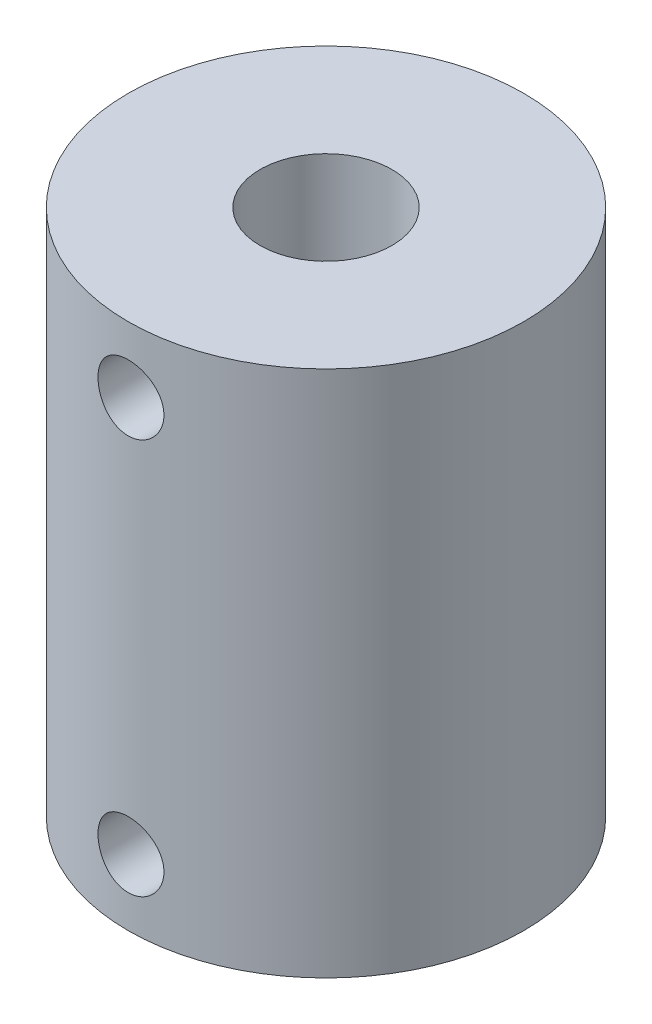
ISO-10303-21;
HEADER;
FILE_DESCRIPTION(('STEP AP214'),'2;1');
FILE_NAME('part.step','',(''),(''),'','','');
FILE_SCHEMA(('AUTOMOTIVE_DESIGN { 1 0 10303 214 1 1 1 1 }'));
ENDSEC;
DATA;
#1=APPLICATION_CONTEXT('core data for automotive mechanical design processes');
#2=APPLICATION_PROTOCOL_DEFINITION('international standard','automotive_design',2000,#1);
#3=PRODUCT_CONTEXT('',#1,'mechanical');
#4=PRODUCT('Part','Part','',(#3));
#5=PRODUCT_RELATED_PRODUCT_CATEGORY('part','',(#4));
#6=PRODUCT_DEFINITION_FORMATION('','',#4);
#7=PRODUCT_DEFINITION_CONTEXT('part definition',#1,'design');
#8=PRODUCT_DEFINITION('design','',#6,#7);
#9=PRODUCT_DEFINITION_SHAPE('','',#8);
#10=(LENGTH_UNIT() NAMED_UNIT(*) SI_UNIT(.MILLI.,.METRE.));
#11=(NAMED_UNIT(*) PLANE_ANGLE_UNIT() SI_UNIT($,.RADIAN.));
#12=(NAMED_UNIT(*) SI_UNIT($,.STERADIAN.) SOLID_ANGLE_UNIT());
#13=UNCERTAINTY_MEASURE_WITH_UNIT(LENGTH_MEASURE(1.E-05),#10,'distance_accuracy_value','');
#14=(GEOMETRIC_REPRESENTATION_CONTEXT(3) GLOBAL_UNCERTAINTY_ASSIGNED_CONTEXT((#13)) GLOBAL_UNIT_ASSIGNED_CONTEXT((#10,
#11,#12)) REPRESENTATION_CONTEXT('',''));
#15=CARTESIAN_POINT('',(0.,0.,0.));
#16=DIRECTION('',(0.,0.,1.));
#17=DIRECTION('',(1.,0.,0.));
#18=AXIS2_PLACEMENT_3D('',#15,#16,#17);
#19=CARTESIAN_POINT('',(0.,25.4,0.));
#20=DIRECTION('',(0.,-1.,0.));
#21=DIRECTION('',(0.,0.,-1.));
#22=AXIS2_PLACEMENT_3D('',#19,#20,#21);
#23=CYLINDRICAL_SURFACE('',#22,9.525);
#24=CARTESIAN_POINT('',(0.,25.4,0.));
#25=DIRECTION('',(0.,1.,0.));
#26=DIRECTION('',(0.,0.,1.));
#27=AXIS2_PLACEMENT_3D('',#24,#25,#26);
#28=CIRCLE('',#27,9.525);
#29=CARTESIAN_POINT('',(0.,25.4,9.525));
#30=VERTEX_POINT('',#29);
#31=EDGE_CURVE('E55',#30,#30,#28,.T.);
#32=ORIENTED_EDGE('',*,*,#31,.F.);
#33=EDGE_LOOP('',(#32));
#34=FACE_BOUND('',#33,.T.);
#35=CARTESIAN_POINT('',(0.,0.,0.));
#36=DIRECTION('',(0.,1.,0.));
#37=DIRECTION('',(0.,0.,1.));
#38=AXIS2_PLACEMENT_3D('',#35,#36,#37);
#39=CIRCLE('',#38,9.525);
#40=CARTESIAN_POINT('',(0.,0.,9.525));
#41=VERTEX_POINT('',#40);
#42=EDGE_CURVE('E59',#41,#41,#39,.T.);
#43=ORIENTED_EDGE('',*,*,#42,.T.);
#44=EDGE_LOOP('',(#43));
#45=FACE_BOUND('',#44,.T.);
#46=CARTESIAN_POINT('',(0.,20.6375,9.525));
#47=CARTESIAN_POINT('',(0.0885132246484665,20.6375035489819,9.52499848342203));
#48=CARTESIAN_POINT('',(0.177074754967651,20.6449277696053,9.52375335474776));
#49=CARTESIAN_POINT('',(0.351713940762382,20.674416143316,9.51890619037781));
#50=CARTESIAN_POINT('',(0.437789236154121,20.6964937586389,9.5153019874167));
#51=CARTESIAN_POINT('',(0.604904014480028,20.7546038098564,9.50614093330146));
#52=CARTESIAN_POINT('',(0.685947553954255,20.7906248306818,9.50058567976088));
#53=CARTESIAN_POINT('',(0.840830069655994,20.8755693054533,9.48813334197115));
#54=CARTESIAN_POINT('',(0.914669868572905,20.9244912837017,9.48123641121565));
#55=CARTESIAN_POINT('',(1.05376511007522,21.034346478226,9.46679156586028));
#56=CARTESIAN_POINT('',(1.1189416937447,21.0953788877939,9.45923858602434));
#57=CARTESIAN_POINT('',(1.23817919664905,21.2275089599802,9.44437168066725));
#58=CARTESIAN_POINT('',(1.29223941411327,21.2986072575749,9.43705777026294));
#59=CARTESIAN_POINT('',(1.38802562475926,21.4493925635351,9.42344804257461));
#60=CARTESIAN_POINT('',(1.42967364106673,21.529129748871,9.41715876973189));
#61=CARTESIAN_POINT('',(1.49895456203612,21.6945905733309,9.40638066519618));
#62=CARTESIAN_POINT('',(1.52658841339416,21.7803138076353,9.40189171189085));
#63=CARTESIAN_POINT('',(1.56680812989335,21.9544774745339,9.3952729089515));
#64=CARTESIAN_POINT('',(1.57953013350098,22.0428856426784,9.39312172988419));
#65=CARTESIAN_POINT('',(1.58998712055907,22.220605975821,9.39135751224772));
#66=CARTESIAN_POINT('',(1.58772316464701,22.3099180763962,9.39174429405331));
#67=CARTESIAN_POINT('',(1.56838338748156,22.4859391919099,9.39499282328357));
#68=CARTESIAN_POINT('',(1.55146050000001,22.5726655502512,9.39782901557512));
#69=CARTESIAN_POINT('',(1.50352324415619,22.7420305368215,9.4056167945899));
#70=CARTESIAN_POINT('',(1.47250839249303,22.8246690247442,9.41056845386527));
#71=CARTESIAN_POINT('',(1.39711255126963,22.983970302885,9.42205684377153));
#72=CARTESIAN_POINT('',(1.35266805531362,23.0606024728616,9.42860107613151));
#73=CARTESIAN_POINT('',(1.25171963114897,23.2053792943419,9.44253203193531));
#74=CARTESIAN_POINT('',(1.19521472961547,23.2735232601089,9.44991882335472));
#75=CARTESIAN_POINT('',(1.070916204721,23.4002745644877,9.46481487703664));
#76=CARTESIAN_POINT('',(1.00299136705944,23.4587532592729,9.47232452262099));
#77=CARTESIAN_POINT('',(0.858224883103348,23.5635023792925,9.48653551886919));
#78=CARTESIAN_POINT('',(0.781383179360579,23.6097727258663,9.49323686432489));
#79=CARTESIAN_POINT('',(0.620843256765861,23.6888034142315,9.50508571986999));
#80=CARTESIAN_POINT('',(0.53713934073356,23.7215523912753,9.51023192188729));
#81=CARTESIAN_POINT('',(0.365314449457734,23.7724913266812,9.51838014413039));
#82=CARTESIAN_POINT('',(0.277193844378962,23.7906825029783,9.52138234372551));
#83=CARTESIAN_POINT('',(0.100145787326531,23.8118150626228,9.52488017450106));
#84=CARTESIAN_POINT('',(0.0112399680908924,23.8149330480966,9.52540483163118));
#85=CARTESIAN_POINT('',(-0.165823755785078,23.8063015462881,9.52396796257443));
#86=CARTESIAN_POINT('',(-0.253981689071444,23.7945526310601,9.52200653204815));
#87=CARTESIAN_POINT('',(-0.426501671472194,23.756667720672,9.51583585105758));
#88=CARTESIAN_POINT('',(-0.510883451424715,23.7306191576723,9.51164026548832));
#89=CARTESIAN_POINT('',(-0.67408227188638,23.6649675809433,9.50146984929153));
#90=CARTESIAN_POINT('',(-0.752898999602671,23.6253638060516,9.49549491875133));
#91=CARTESIAN_POINT('',(-0.903497487812788,23.5333215358175,9.48235667852029));
#92=CARTESIAN_POINT('',(-0.975210934345088,23.4807727258338,9.47518333488259));
#93=CARTESIAN_POINT('',(-1.10886467679421,23.3644838047305,9.46047426793857));
#94=CARTESIAN_POINT('',(-1.17080426220733,23.3007428807193,9.45293851833932));
#95=CARTESIAN_POINT('',(-1.28380666508283,23.1630870569746,9.43826011274762));
#96=CARTESIAN_POINT('',(-1.33475016330721,23.0890736048983,9.43112233747062));
#97=CARTESIAN_POINT('',(-1.42348096703731,22.933435864597,9.41813921408956));
#98=CARTESIAN_POINT('',(-1.46126868957884,22.8518118177305,9.41229382501923));
#99=CARTESIAN_POINT('',(-1.52243684048545,22.6836035196643,9.40259393098042));
#100=CARTESIAN_POINT('',(-1.54587665966794,22.5970413596556,9.39873122987526));
#101=CARTESIAN_POINT('',(-1.57787051314921,22.4211387179442,9.39341350190391));
#102=CARTESIAN_POINT('',(-1.58642584158582,22.3317984784701,9.39195826572028));
#103=CARTESIAN_POINT('',(-1.58837176994007,22.1540672196139,9.39162925508347));
#104=CARTESIAN_POINT('',(-1.58195018643949,22.0656782596047,9.39272350881088));
#105=CARTESIAN_POINT('',(-1.5545306977376,21.8912571774878,9.39730011223118));
#106=CARTESIAN_POINT('',(-1.53353283978142,21.8052250477419,9.40078245418371));
#107=CARTESIAN_POINT('',(-1.47762880089276,21.6380323923192,9.40973071238892));
#108=CARTESIAN_POINT('',(-1.44273879003128,21.5568663286144,9.4151943218449));
#109=CARTESIAN_POINT('',(-1.3600601474866,21.4015093500613,9.42749174265602));
#110=CARTESIAN_POINT('',(-1.31227087605534,21.3273187814137,9.43432562196633));
#111=CARTESIAN_POINT('',(-1.20447999157632,21.1870699047266,9.4486949331897));
#112=CARTESIAN_POINT('',(-1.14434020788197,21.1211185293953,9.45623772690952));
#113=CARTESIAN_POINT('',(-1.01384673492645,21.0001792311584,9.47111626449134));
#114=CARTESIAN_POINT('',(-0.943490691699524,20.9451938419148,9.47845196016857));
#115=CARTESIAN_POINT('',(-0.793984422721577,20.847400349693,9.4921484632281));
#116=CARTESIAN_POINT('',(-0.714776820083338,20.8046789650363,9.49850218820721));
#117=CARTESIAN_POINT('',(-0.550235799055653,20.7332138772727,9.50944991427127));
#118=CARTESIAN_POINT('',(-0.464908579217056,20.7044562535144,9.51404566692701));
#119=CARTESIAN_POINT('',(-0.31604160187883,20.6679766509296,9.51995677178927));
#120=CARTESIAN_POINT('',(-0.253402357239514,20.6565662117939,9.52183787318583));
#121=CARTESIAN_POINT('',(-0.127183712053079,20.6413266764686,9.52436002151187));
#122=CARTESIAN_POINT('',(-0.0636043277113938,20.6374974497528,9.52500108979108));
#123=CARTESIAN_POINT('',(0.,20.6375,9.525));
#124=B_SPLINE_CURVE_WITH_KNOTS('',3,(#46,#47,#48,#49,#50,#51,#52,#53,#54,#55,#56,#57,#58,#59,
#60,#61,#62,#63,#64,#65,#66,#67,#68,#69,#70,#71,#72,#73,#74,#75,#76,#77,#78,#79,#80,#81,#82,#83,
#84,#85,#86,#87,#88,#89,#90,#91,#92,#93,#94,#95,#96,#97,#98,#99,#100,#101,#102,#103,#104,#105,
#106,#107,#108,#109,#110,#111,#112,#113,#114,#115,#116,#117,#118,#119,#120,#121,#122,#123),
.UNSPECIFIED.,.T.,.F.,(4,2,2,2,2,2,2,2,2,2,2,2,2,2,2,2,2,2,2,2,2,2,2,2,2,2,2,2,2,2,2,2,2,2,2,2,
2,2,4),(0.,0.265307181435954,0.530858441516591,0.796192760561045,1.06149674204849,
1.32907081824581,1.59666178107859,1.86590000723138,2.13512004316375,2.40186258960674,
2.66858625743763,2.93256031317859,3.19654342291117,3.46179493461674,3.72706786132164,
3.99562808893692,4.26419004688763,4.53297727461598,4.80174201270929,5.06735006017037,
5.33294788777771,5.59693957449074,5.86094608749552,6.1272853427316,6.3936439503947,
6.66276176974838,6.93187105733724,7.19985874187025,7.46782312494502,7.73244522546914,
7.99706646829464,8.26138059573651,8.52570783443628,8.79317128962803,9.06069647013147,
9.33006917070572,9.59917277602595,9.78982197584151,9.98046789320874),.UNSPECIFIED.);
#125=CARTESIAN_POINT('',(0.,20.6375,9.525));
#126=VERTEX_POINT('',#125);
#127=EDGE_CURVE('E85',#126,#126,#124,.T.);
#128=ORIENTED_EDGE('',*,*,#127,.F.);
#129=EDGE_LOOP('',(#128));
#130=FACE_BOUND('',#129,.T.);
#131=CARTESIAN_POINT('',(0.,1.5875,9.525));
#132=CARTESIAN_POINT('',(0.0885132246484664,1.58750354898186,9.52499848342203));
#133=CARTESIAN_POINT('',(0.177074754967651,1.59492776960526,9.52375335474776));
#134=CARTESIAN_POINT('',(0.351713940762382,1.62441614331598,9.51890619037781));
#135=CARTESIAN_POINT('',(0.437789236154122,1.64649375863887,9.5153019874167));
#136=CARTESIAN_POINT('',(0.604904014480029,1.7046038098564,9.50614093330146));
#137=CARTESIAN_POINT('',(0.685947553954257,1.74062483068176,9.50058567976088));
#138=CARTESIAN_POINT('',(0.840830069655995,1.82556930545327,9.48813334197115));
#139=CARTESIAN_POINT('',(0.914669868572905,1.8744912837017,9.48123641121565));
#140=CARTESIAN_POINT('',(1.05376511007522,1.98434647822599,9.46679156586028));
#141=CARTESIAN_POINT('',(1.1189416937447,2.04537888779394,9.45923858602434));
#142=CARTESIAN_POINT('',(1.23817919664905,2.17750895998023,9.44437168066725));
#143=CARTESIAN_POINT('',(1.29223941411327,2.24860725757495,9.43705777026294));
#144=CARTESIAN_POINT('',(1.38802562475926,2.39939256353513,9.42344804257461));
#145=CARTESIAN_POINT('',(1.42967364106674,2.47912974887102,9.41715876973189));
#146=CARTESIAN_POINT('',(1.49895456203612,2.64459057333089,9.40638066519618));
#147=CARTESIAN_POINT('',(1.52658841339416,2.73031380763529,9.40189171189085));
#148=CARTESIAN_POINT('',(1.56680812989335,2.9044774745339,9.3952729089515));
#149=CARTESIAN_POINT('',(1.57953013350098,2.99288564267838,9.39312172988419));
#150=CARTESIAN_POINT('',(1.58998712055907,3.170605975821,9.39135751224772));
#151=CARTESIAN_POINT('',(1.58772316464701,3.25991807639623,9.39174429405331));
#152=CARTESIAN_POINT('',(1.56838338748156,3.43593919190991,9.39499282328357));
#153=CARTESIAN_POINT('',(1.55146050000001,3.52266555025122,9.39782901557512));
#154=CARTESIAN_POINT('',(1.50352324415619,3.6920305368215,9.4056167945899));
#155=CARTESIAN_POINT('',(1.47250839249304,3.77466902474422,9.41056845386527));
#156=CARTESIAN_POINT('',(1.39711255126963,3.93397030288498,9.42205684377153));
#157=CARTESIAN_POINT('',(1.35266805531362,4.01060247286158,9.42860107613151));
#158=CARTESIAN_POINT('',(1.25171963114897,4.15537929434187,9.44253203193531));
#159=CARTESIAN_POINT('',(1.19521472961547,4.22352326010888,9.44991882335472));
#160=CARTESIAN_POINT('',(1.070916204721,4.35027456448766,9.46481487703664));
#161=CARTESIAN_POINT('',(1.00299136705943,4.40875325927295,9.47232452262099));
#162=CARTESIAN_POINT('',(0.858224883103345,4.51350237929249,9.48653551886919));
#163=CARTESIAN_POINT('',(0.781383179360577,4.55977272586635,9.49323686432489));
#164=CARTESIAN_POINT('',(0.620843256765861,4.63880341423154,9.50508571986999));
#165=CARTESIAN_POINT('',(0.537139340733559,4.67155239127535,9.51023192188729));
#166=CARTESIAN_POINT('',(0.365314449457734,4.72249132668119,9.51838014413039));
#167=CARTESIAN_POINT('',(0.277193844378962,4.74068250297831,9.52138234372551));
#168=CARTESIAN_POINT('',(0.10014578732653,4.76181506262282,9.52488017450106));
#169=CARTESIAN_POINT('',(0.0112399680908913,4.76493304809656,9.52540483163118));
#170=CARTESIAN_POINT('',(-0.165823755785079,4.75630154628814,9.52396796257443));
#171=CARTESIAN_POINT('',(-0.253981689071445,4.74455263106007,9.52200653204815));
#172=CARTESIAN_POINT('',(-0.426501671472195,4.70666772067197,9.51583585105758));
#173=CARTESIAN_POINT('',(-0.510883451424716,4.68061915767227,9.51164026548833));
#174=CARTESIAN_POINT('',(-0.674082271886381,4.61496758094329,9.50146984929153));
#175=CARTESIAN_POINT('',(-0.752898999602672,4.5753638060516,9.49549491875132));
#176=CARTESIAN_POINT('',(-0.903497487812789,4.48332153581754,9.48235667852029));
#177=CARTESIAN_POINT('',(-0.975210934345089,4.43077272583379,9.47518333488259));
#178=CARTESIAN_POINT('',(-1.10886467679421,4.31448380473048,9.46047426793857));
#179=CARTESIAN_POINT('',(-1.17080426220733,4.25074288071931,9.45293851833932));
#180=CARTESIAN_POINT('',(-1.28380666508283,4.11308705697464,9.43826011274762));
#181=CARTESIAN_POINT('',(-1.33475016330721,4.03907360489835,9.43112233747062));
#182=CARTESIAN_POINT('',(-1.42348096703732,3.88343586459702,9.41813921408956));
#183=CARTESIAN_POINT('',(-1.46126868957884,3.80181181773054,9.41229382501923));
#184=CARTESIAN_POINT('',(-1.52243684048545,3.63360351966429,9.40259393098042));
#185=CARTESIAN_POINT('',(-1.54587665966795,3.54704135965564,9.39873122987526));
#186=CARTESIAN_POINT('',(-1.57787051314921,3.37113871794418,9.39341350190391));
#187=CARTESIAN_POINT('',(-1.58642584158582,3.28179847847014,9.39195826572028));
#188=CARTESIAN_POINT('',(-1.58837176994007,3.10406721961387,9.39162925508347));
#189=CARTESIAN_POINT('',(-1.58195018643949,3.01567825960469,9.39272350881088));
#190=CARTESIAN_POINT('',(-1.5545306977376,2.84125717748776,9.39730011223117));
#191=CARTESIAN_POINT('',(-1.53353283978142,2.75522504774191,9.40078245418371));
#192=CARTESIAN_POINT('',(-1.47762880089276,2.58803239231919,9.40973071238892));
#193=CARTESIAN_POINT('',(-1.44273879003128,2.50686632861442,9.4151943218449));
#194=CARTESIAN_POINT('',(-1.3600601474866,2.35150935006127,9.42749174265602));
#195=CARTESIAN_POINT('',(-1.31227087605534,2.27731878141369,9.43432562196633));
#196=CARTESIAN_POINT('',(-1.20447999157632,2.13706990472657,9.4486949331897));
#197=CARTESIAN_POINT('',(-1.14434020788197,2.07111852939532,9.45623772690952));
#198=CARTESIAN_POINT('',(-1.01384673492645,1.95017923115841,9.47111626449134));
#199=CARTESIAN_POINT('',(-0.943490691699524,1.89519384191476,9.47845196016857));
#200=CARTESIAN_POINT('',(-0.793984422721578,1.79740034969303,9.4921484632281));
#201=CARTESIAN_POINT('',(-0.714776820083339,1.75467896503627,9.49850218820721));
#202=CARTESIAN_POINT('',(-0.550235799055653,1.6832138772727,9.50944991427127));
#203=CARTESIAN_POINT('',(-0.464908579217056,1.65445625351439,9.51404566692701));
#204=CARTESIAN_POINT('',(-0.316041601878829,1.61797665092956,9.51995677178927));
#205=CARTESIAN_POINT('',(-0.253402357239514,1.60656621179386,9.52183787318583));
#206=CARTESIAN_POINT('',(-0.127183712053079,1.59132667646858,9.52436002151187));
#207=CARTESIAN_POINT('',(-0.0636043277113937,1.58749744975277,9.52500108979108));
#208=CARTESIAN_POINT('',(0.,1.5875,9.525));
#209=B_SPLINE_CURVE_WITH_KNOTS('',3,(#131,#132,#133,#134,#135,#136,#137,#138,#139,#140,#141,
#142,#143,#144,#145,#146,#147,#148,#149,#150,#151,#152,#153,#154,#155,#156,#157,#158,#159,#160,
#161,#162,#163,#164,#165,#166,#167,#168,#169,#170,#171,#172,#173,#174,#175,#176,#177,#178,#179,
#180,#181,#182,#183,#184,#185,#186,#187,#188,#189,#190,#191,#192,#193,#194,#195,#196,#197,#198,
#199,#200,#201,#202,#203,#204,#205,#206,#207,#208),.UNSPECIFIED.,.T.,.F.,(4,2,2,2,2,2,2,2,2,2,2,
2,2,2,2,2,2,2,2,2,2,2,2,2,2,2,2,2,2,2,2,2,2,2,2,2,2,2,4),(0.,0.265307181435954,
0.530858441516592,0.796192760561047,1.06149674204849,1.32907081824581,1.59666178107859,
1.86590000723138,2.13512004316375,2.40186258960674,2.66858625743763,2.93256031317859,
3.19654342291117,3.46179493461674,3.72706786132164,3.99562808893692,4.26419004688763,
4.53297727461599,4.8017420127093,5.06735006017037,5.33294788777771,5.59693957449074,
5.86094608749552,6.1272853427316,6.3936439503947,6.66276176974838,6.93187105733724,
7.19985874187025,7.46782312494502,7.73244522546915,7.99706646829464,8.26138059573652,
8.52570783443628,8.79317128962804,9.06069647013148,9.33006917070572,9.59917277602596,
9.78982197584151,9.98046789320875),.UNSPECIFIED.);
#210=CARTESIAN_POINT('',(0.,1.5875,9.525));
#211=VERTEX_POINT('',#210);
#212=EDGE_CURVE('E12',#211,#211,#209,.T.);
#213=ORIENTED_EDGE('',*,*,#212,.F.);
#214=EDGE_LOOP('',(#213));
#215=FACE_BOUND('',#214,.T.);
#216=ADVANCED_FACE('F43',(#34,#45,#130,#215),#23,.T.);
#217=CARTESIAN_POINT('',(0.,12.7,0.));
#218=DIRECTION('',(0.,1.,0.));
#219=DIRECTION('',(0.,0.,1.));
#220=AXIS2_PLACEMENT_3D('',#217,#218,#219);
#221=CYLINDRICAL_SURFACE('',#220,3.175);
#222=CARTESIAN_POINT('',(0.,25.4,0.));
#223=DIRECTION('',(0.,1.,0.));
#224=DIRECTION('',(0.,0.,1.));
#225=AXIS2_PLACEMENT_3D('',#222,#223,#224);
#226=CIRCLE('',#225,3.175);
#227=CARTESIAN_POINT('',(0.,25.4,3.175));
#228=VERTEX_POINT('',#227);
#229=EDGE_CURVE('E91',#228,#228,#226,.T.);
#230=ORIENTED_EDGE('',*,*,#229,.T.);
#231=EDGE_LOOP('',(#230));
#232=FACE_BOUND('',#231,.T.);
#233=CARTESIAN_POINT('',(0.,12.7,0.));
#234=DIRECTION('',(0.,1.,0.));
#235=DIRECTION('',(0.,0.,1.));
#236=AXIS2_PLACEMENT_3D('',#233,#234,#235);
#237=CIRCLE('',#236,3.175);
#238=CARTESIAN_POINT('',(0.,12.7,3.175));
#239=VERTEX_POINT('',#238);
#240=EDGE_CURVE('E94',#239,#239,#237,.T.);
#241=ORIENTED_EDGE('',*,*,#240,.F.);
#242=EDGE_LOOP('',(#241));
#243=FACE_BOUND('',#242,.T.);
#244=CARTESIAN_POINT('',(0.,20.6375,3.175));
#245=CARTESIAN_POINT('',(-0.0834579911850833,20.6375052424285,3.17499545030503));
#246=CARTESIAN_POINT('',(-0.167015477019881,20.6441199910797,3.17167404493863));
#247=CARTESIAN_POINT('',(-0.331660873489373,20.6702864475422,3.15871472708987));
#248=CARTESIAN_POINT('',(-0.412743787657887,20.689862723884,3.1490648192841));
#249=CARTESIAN_POINT('',(-0.569807002497712,20.7409951711789,3.12445843552858));
#250=CARTESIAN_POINT('',(-0.645805799665893,20.7725047849936,3.10952259694341));
#251=CARTESIAN_POINT('',(-0.791325279180474,20.8463683614169,3.07571420218771));
#252=CARTESIAN_POINT('',(-0.860846471709217,20.8887214689951,3.05684195643221));
#253=CARTESIAN_POINT('',(-0.99616866069703,20.9859836335579,3.01555559984673));
#254=CARTESIAN_POINT('',(-1.06149014765635,21.0414972857929,2.99299628614965));
#255=CARTESIAN_POINT('',(-1.18233736872633,21.1622028483047,2.94735202766704));
#256=CARTESIAN_POINT('',(-1.23785563818199,21.2274020646888,2.92426669731842));
#257=CARTESIAN_POINT('',(-1.34183755071482,21.3716923173684,2.87812085025789));
#258=CARTESIAN_POINT('',(-1.38942022018822,21.4514685561241,2.85520109315084));
#259=CARTESIAN_POINT('',(-1.47029206018898,21.6191581458781,2.81441491301059));
#260=CARTESIAN_POINT('',(-1.50359144125905,21.7070656293474,2.79654488326096));
#261=CARTESIAN_POINT('',(-1.55278525197438,21.8831558548573,2.76951863922521));
#262=CARTESIAN_POINT('',(-1.5696022981152,21.971007067657,2.75990481139145));
#263=CARTESIAN_POINT('',(-1.58817785187779,22.1487664049749,2.74926250293288));
#264=CARTESIAN_POINT('',(-1.58995124029225,22.238672408633,2.7482255383247));
#265=CARTESIAN_POINT('',(-1.57906606838602,22.4064290636006,2.75448601783382));
#266=CARTESIAN_POINT('',(-1.5681079882647,22.4844356495666,2.76080162313447));
#267=CARTESIAN_POINT('',(-1.53501701037788,22.6373085311297,2.77933513114987));
#268=CARTESIAN_POINT('',(-1.51288055293752,22.7121738181722,2.79155491395445));
#269=CARTESIAN_POINT('',(-1.45765802636278,22.858776247948,2.82078868805226));
#270=CARTESIAN_POINT('',(-1.42432891904664,22.9303999080724,2.83790772054098));
#271=CARTESIAN_POINT('',(-1.34785367917295,23.0673819394866,2.87501654296728));
#272=CARTESIAN_POINT('',(-1.30470313705229,23.1327374777651,2.89500762088552));
#273=CARTESIAN_POINT('',(-1.20342986217405,23.2640524887299,2.93867138171466));
#274=CARTESIAN_POINT('',(-1.14410245266124,23.3290377868021,2.96248947500834));
#275=CARTESIAN_POINT('',(-1.01529448125193,23.4485424770131,3.00906851989396));
#276=CARTESIAN_POINT('',(-0.94580909481168,23.5030568673538,3.03182896234596));
#277=CARTESIAN_POINT('',(-0.794569953008061,23.6024509868847,3.07501904811705));
#278=CARTESIAN_POINT('',(-0.712396326664063,23.6467657500076,3.09529137357186));
#279=CARTESIAN_POINT('',(-0.540490117088466,23.7205790336058,3.12988136279972));
#280=CARTESIAN_POINT('',(-0.450763602321126,23.7500893187116,3.14420375322891));
#281=CARTESIAN_POINT('',(-0.274266805511365,23.7910297034002,3.16427379814529));
#282=CARTESIAN_POINT('',(-0.187867179745468,23.803754836748,3.1706333955333));
#283=CARTESIAN_POINT('',(-0.0139376149195961,23.814825260676,3.17615908866327));
#284=CARTESIAN_POINT('',(0.0735917690434798,23.8131773634527,3.17532859220093));
#285=CARTESIAN_POINT('',(0.240082343027754,23.7962968821352,3.16692267702328));
#286=CARTESIAN_POINT('',(0.319181810279263,23.7821271042911,3.15987502529967));
#287=CARTESIAN_POINT('',(0.473720941529331,23.7422720608665,3.14042696962309));
#288=CARTESIAN_POINT('',(0.5491602010346,23.7165855257551,3.12802597555879));
#289=CARTESIAN_POINT('',(0.696735665913696,23.6537524345376,3.09854999119071));
#290=CARTESIAN_POINT('',(0.768715755246711,23.6162992079404,3.08135149809289));
#291=CARTESIAN_POINT('',(0.905607411697592,23.5313417871611,3.043935592289));
#292=CARTESIAN_POINT('',(0.970515949770338,23.4838333113298,3.02371689462515));
#293=CARTESIAN_POINT('',(1.09818120674663,23.3747303247875,2.97986801371214));
#294=CARTESIAN_POINT('',(1.1601006735377,23.3122106963433,2.95609779689055));
#295=CARTESIAN_POINT('',(1.27294690977618,23.1776188223466,2.90929046679002));
#296=CARTESIAN_POINT('',(1.3238660748176,23.1055400238289,2.88625386997575));
#297=CARTESIAN_POINT('',(1.41558631423544,22.9494656990004,2.84243767627802));
#298=CARTESIAN_POINT('',(1.45577797458289,22.865062115075,2.82182140722634));
#299=CARTESIAN_POINT('',(1.52095648617134,22.6893277677247,2.78723839766939));
#300=CARTESIAN_POINT('',(1.54596292893889,22.5980061017338,2.77326309427028));
#301=CARTESIAN_POINT('',(1.57775542885366,22.4204050211705,2.75528882878461));
#302=CARTESIAN_POINT('',(1.58606013179365,22.3344831226716,2.75046096250791));
#303=CARTESIAN_POINT('',(1.58859403257222,22.1623777808763,2.74900000493545));
#304=CARTESIAN_POINT('',(1.5828293315144,22.0761944671286,2.75236336156894));
#305=CARTESIAN_POINT('',(1.55880772437938,21.9146699413157,2.76602606006084));
#306=CARTESIAN_POINT('',(1.54179319901956,21.8390780036452,2.7756341249122));
#307=CARTESIAN_POINT('',(1.49729088118125,21.6919046104138,2.79988988197899));
#308=CARTESIAN_POINT('',(1.46979971971638,21.6203244534289,2.81453919516849));
#309=CARTESIAN_POINT('',(1.40305749566465,21.4778830490589,2.848427919537));
#310=CARTESIAN_POINT('',(1.36314043128242,21.4073932058464,2.86790959303524));
#311=CARTESIAN_POINT('',(1.27341466747436,21.2736516738123,2.90886088970341));
#312=CARTESIAN_POINT('',(1.22360082184598,21.2104037777977,2.93033154400532));
#313=CARTESIAN_POINT('',(1.10839778107493,21.084949603012,2.97596438013471));
#314=CARTESIAN_POINT('',(1.04185152150815,21.0238036750189,3.00013660999272));
#315=CARTESIAN_POINT('',(0.898770754895199,20.9133075137965,3.0460593171264));
#316=CARTESIAN_POINT('',(0.822230898247,20.8639636385915,3.06780848569085));
#317=CARTESIAN_POINT('',(0.660291409892925,20.7784122741946,3.10670590186878));
#318=CARTESIAN_POINT('',(0.574832962245558,20.7423001313371,3.12382053184118));
#319=CARTESIAN_POINT('',(0.398053085556711,20.6854295336851,3.15120879312142));
#320=CARTESIAN_POINT('',(0.306749131847695,20.6646274431959,3.1615018583887));
#321=CARTESIAN_POINT('',(0.178755590054295,20.6471878599014,3.17016545787646));
#322=CARTESIAN_POINT('',(0.143131983613483,20.6435600576247,3.17197367477648));
#323=CARTESIAN_POINT('',(0.0716783742405821,20.6387149684964,3.17439193950695));
#324=CARTESIAN_POINT('',(0.0358483656390223,20.6374977481785,3.17500195426617));
#325=CARTESIAN_POINT('',(0.,20.6375,3.175));
#326=B_SPLINE_CURVE_WITH_KNOTS('',3,(#244,#245,#246,#247,#248,#249,#250,#251,#252,#253,#254,
#255,#256,#257,#258,#259,#260,#261,#262,#263,#264,#265,#266,#267,#268,#269,#270,#271,#272,#273,
#274,#275,#276,#277,#278,#279,#280,#281,#282,#283,#284,#285,#286,#287,#288,#289,#290,#291,#292,
#293,#294,#295,#296,#297,#298,#299,#300,#301,#302,#303,#304,#305,#306,#307,#308,#309,#310,#311,
#312,#313,#314,#315,#316,#317,#318,#319,#320,#321,#322,#323,#324,#325),.UNSPECIFIED.,.T.,.F.,(4,
2,2,2,2,2,2,2,2,2,2,2,2,2,2,2,2,2,2,2,2,2,2,2,2,2,2,2,2,2,2,2,2,2,2,2,2,2,2,2,4),(0.,
0.250228508654714,0.50093268766335,0.750668671844021,1.00038496992324,1.26520854196496,
1.53023290227578,1.8158099070882,2.10118242288521,2.36947094272614,2.63749404759819,
2.87346568449796,3.10951251232014,3.35105756267473,3.59271127500602,3.86500594367531,
4.13743036175414,4.42250547765424,4.70735369348243,4.96860973623261,5.22974196161968,
5.47063464078468,5.71155388089103,5.95936158944288,6.20727503062988,6.47953381898014,
6.75198021926997,7.03762057931739,7.32289162713402,7.58077775661086,7.83855207535176,
8.07176964270058,8.30506226951507,8.55402875138705,8.80312503315513,9.08248822877009,
9.36200158617727,9.64349121690848,9.92417542436074,10.0316550721259,10.1391376863632),.UNSPECIFIED.);
#327=CARTESIAN_POINT('',(0.,20.6375,3.175));
#328=VERTEX_POINT('',#327);
#329=EDGE_CURVE('E64',#328,#328,#326,.T.);
#330=ORIENTED_EDGE('',*,*,#329,.F.);
#331=EDGE_LOOP('',(#330));
#332=FACE_BOUND('',#331,.T.);
#333=ADVANCED_FACE('F112',(#232,#243,#332),#221,.F.);
#334=CARTESIAN_POINT('',(0.,25.4,0.));
#335=DIRECTION('',(0.,1.,0.));
#336=DIRECTION('',(0.,0.,1.));
#337=AXIS2_PLACEMENT_3D('',#334,#335,#336);
#338=PLANE('',#337);
#339=ORIENTED_EDGE('',*,*,#229,.F.);
#340=EDGE_LOOP('',(#339));
#341=FACE_BOUND('',#340,.T.);
#342=ORIENTED_EDGE('',*,*,#31,.T.);
#343=EDGE_LOOP('',(#342));
#344=FACE_BOUND('',#343,.T.);
#345=ADVANCED_FACE('F105',(#341,#344),#338,.T.);
#346=CARTESIAN_POINT('',(0.,0.,0.));
#347=DIRECTION('',(0.,1.,0.));
#348=DIRECTION('',(0.,0.,1.));
#349=AXIS2_PLACEMENT_3D('',#346,#347,#348);
#350=PLANE('',#349);
#351=CARTESIAN_POINT('',(0.,0.,0.));
#352=DIRECTION('',(0.,1.,0.));
#353=DIRECTION('',(0.,0.,1.));
#354=AXIS2_PLACEMENT_3D('',#351,#352,#353);
#355=CIRCLE('',#354,3.01625);
#356=CARTESIAN_POINT('',(0.,0.,3.01625));
#357=VERTEX_POINT('',#356);
#358=EDGE_CURVE('E134',#357,#357,#355,.T.);
#359=ORIENTED_EDGE('',*,*,#358,.T.);
#360=EDGE_LOOP('',(#359));
#361=FACE_BOUND('',#360,.T.);
#362=ORIENTED_EDGE('',*,*,#42,.F.);
#363=EDGE_LOOP('',(#362));
#364=FACE_BOUND('',#363,.T.);
#365=ADVANCED_FACE('F103',(#361,#364),#350,.F.);
#366=CARTESIAN_POINT('',(0.,12.7,0.));
#367=DIRECTION('',(0.,1.,0.));
#368=DIRECTION('',(0.,0.,1.));
#369=AXIS2_PLACEMENT_3D('',#366,#367,#368);
#370=PLANE('',#369);
#371=CARTESIAN_POINT('',(0.,12.7,0.));
#372=DIRECTION('',(0.,1.,0.));
#373=DIRECTION('',(0.,0.,1.));
#374=AXIS2_PLACEMENT_3D('',#371,#372,#373);
#375=CIRCLE('',#374,3.01625);
#376=CARTESIAN_POINT('',(0.,12.7,3.01625));
#377=VERTEX_POINT('',#376);
#378=EDGE_CURVE('E92',#377,#377,#375,.T.);
#379=ORIENTED_EDGE('',*,*,#378,.F.);
#380=EDGE_LOOP('',(#379));
#381=FACE_BOUND('',#380,.T.);
#382=ORIENTED_EDGE('',*,*,#240,.T.);
#383=EDGE_LOOP('',(#382));
#384=FACE_BOUND('',#383,.T.);
#385=ADVANCED_FACE('F81',(#381,#384),#370,.T.);
#386=CARTESIAN_POINT('',(0.,22.225,9.525));
#387=DIRECTION('',(0.,0.,-1.));
#388=DIRECTION('',(-1.,0.,0.));
#389=AXIS2_PLACEMENT_3D('',#386,#387,#388);
#390=CYLINDRICAL_SURFACE('',#389,1.5875);
#391=ORIENTED_EDGE('',*,*,#329,.T.);
#392=EDGE_LOOP('',(#391));
#393=FACE_BOUND('',#392,.T.);
#394=ORIENTED_EDGE('',*,*,#127,.T.);
#395=EDGE_LOOP('',(#394));
#396=FACE_BOUND('',#395,.T.);
#397=ADVANCED_FACE('F74',(#393,#396),#390,.F.);
#398=CARTESIAN_POINT('',(0.,3.175,9.525));
#399=DIRECTION('',(0.,0.,-1.));
#400=DIRECTION('',(-1.,0.,0.));
#401=AXIS2_PLACEMENT_3D('',#398,#399,#400);
#402=CYLINDRICAL_SURFACE('',#401,1.5875);
#403=CARTESIAN_POINT('',(-1.5875,3.175,2.56468473939781));
#404=CARTESIAN_POINT('',(-1.58749382015426,3.09297663046472,2.56469291657599));
#405=CARTESIAN_POINT('',(-1.58109962286458,3.01086567050061,2.56868075425025));
#406=CARTESIAN_POINT('',(-1.55587499305096,2.84922071067638,2.58403177923416));
#407=CARTESIAN_POINT('',(-1.53702120263141,2.76969184580096,2.5954088183277));
#408=CARTESIAN_POINT('',(-1.48795313106465,2.61586247653465,2.62384272312591));
#409=CARTESIAN_POINT('',(-1.45780448438662,2.54153465470043,2.64086671011832));
#410=CARTESIAN_POINT('',(-1.38720392203041,2.39901432820959,2.67862418809449));
#411=CARTESIAN_POINT('',(-1.34675055590936,2.33082268908265,2.69935820116137));
#412=CARTESIAN_POINT('',(-1.25233365886196,2.19559878154023,2.74452256717464));
#413=CARTESIAN_POINT('',(-1.19746982130648,2.12924982704893,2.76911749519721));
#414=CARTESIAN_POINT('',(-1.07765494512407,2.0061548823034,2.81790886519442));
#415=CARTESIAN_POINT('',(-1.01269842069193,1.94941414978786,2.84210508249475));
#416=CARTESIAN_POINT('',(-0.868464980437652,1.84287357600905,2.88958843810564));
#417=CARTESIAN_POINT('',(-0.788471843303527,1.7939398265433,2.91266352824348));
#418=CARTESIAN_POINT('',(-0.619945219774978,1.71053976403442,2.95312010705991));
#419=CARTESIAN_POINT('',(-0.531417749498908,1.67606334996462,2.97050556908724));
#420=CARTESIAN_POINT('',(-0.35559621669113,1.62534917150147,2.99642945160862));
#421=CARTESIAN_POINT('',(-0.26873758495634,1.60790570706009,3.00554875222577));
#422=CARTESIAN_POINT('',(-0.0928875035580338,1.58775564376292,3.01610248072121));
#423=CARTESIAN_POINT('',(-0.00389754998835127,1.58503899521115,3.01754214923064));
#424=CARTESIAN_POINT('',(0.1645134748524,1.59401513057018,3.01282496017876));
#425=CARTESIAN_POINT('',(0.244032200411881,1.60434811975106,3.00738490539036));
#426=CARTESIAN_POINT('',(0.400012504478426,1.63665985415218,2.9906366574825));
#427=CARTESIAN_POINT('',(0.476473851111846,1.65863948086633,2.97932802019157));
#428=CARTESIAN_POINT('',(0.625403301870395,1.71369485251476,2.95168572375236));
#429=CARTESIAN_POINT('',(0.69780985593227,1.7469053059078,2.93529127003073));
#430=CARTESIAN_POINT('',(0.836181832265845,1.82325755768994,2.89891182515916));
#431=CARTESIAN_POINT('',(0.902145044991292,1.86640274598231,2.87892560894998));
#432=CARTESIAN_POINT('',(1.03292595829165,1.96641851782611,2.83479479130846));
#433=CARTESIAN_POINT('',(1.09694475442671,2.02423878101897,2.8104339963413));
#434=CARTESIAN_POINT('',(1.21483135146227,2.14945327877134,2.7615268352712));
#435=CARTESIAN_POINT('',(1.2686898893635,2.21685615247584,2.73698032084906));
#436=CARTESIAN_POINT('',(1.36876726814244,2.36552200328347,2.68841298932981));
#437=CARTESIAN_POINT('',(1.41409784646675,2.44744823943556,2.664572980758));
#438=CARTESIAN_POINT('',(1.49000536379329,2.61927096770789,2.62288772881961));
#439=CARTESIAN_POINT('',(1.52059881842837,2.70915840342696,2.60503578158706));
#440=CARTESIAN_POINT('',(1.56356375824471,2.88676826819805,2.57946035206675));
#441=CARTESIAN_POINT('',(1.57721048295658,2.97407632659304,2.57103359965726));
#442=CARTESIAN_POINT('',(1.58974954441708,3.15011575670762,2.56330378835));
#443=CARTESIAN_POINT('',(1.5886552450972,3.2388457664175,2.56399246556755));
#444=CARTESIAN_POINT('',(1.57291324177729,3.40309761614817,2.57366731257267));
#445=CARTESIAN_POINT('',(1.56001109095383,3.4788612814821,2.5815845375272));
#446=CARTESIAN_POINT('',(1.52371130044921,3.62697019087536,2.60317316789026));
#447=CARTESIAN_POINT('',(1.50030972311249,3.6993141411589,2.61684673201035));
#448=CARTESIAN_POINT('',(1.44260816772446,3.84226934225151,2.64910921400893));
#449=CARTESIAN_POINT('',(1.40786564094994,3.91265658526195,2.66789142800664));
#450=CARTESIAN_POINT('',(1.32884162630975,4.04701988530606,2.7081191358812));
#451=CARTESIAN_POINT('',(1.28455525255331,4.11099263382224,2.72956599150811));
#452=CARTESIAN_POINT('',(1.18034128985075,4.24026485692442,2.77637602668784));
#453=CARTESIAN_POINT('',(1.11908388583176,4.30445304215184,2.80186160808416));
#454=CARTESIAN_POINT('',(0.986365261761439,4.42203783484949,2.85129150712466));
#455=CARTESIAN_POINT('',(0.914899369330377,4.47542947360824,2.87523511169209));
#456=CARTESIAN_POINT('',(0.760208432117307,4.57172640385348,2.9200283343093));
#457=CARTESIAN_POINT('',(0.676639373808947,4.6141552827407,2.94072552456341));
#458=CARTESIAN_POINT('',(0.50214812519932,4.68390934891935,2.97548241102068));
#459=CARTESIAN_POINT('',(0.411233140763647,4.7112491362715,2.98954852146414));
#460=CARTESIAN_POINT('',(0.234189354780641,4.74747080792308,3.00833174338227));
#461=CARTESIAN_POINT('',(0.148458028288627,4.75789230432968,3.01382659856182));
#462=CARTESIAN_POINT('',(-0.0236985625611226,4.76465558082815,3.01738317531408));
#463=CARTESIAN_POINT('',(-0.110123509279772,4.76100347545116,3.01544812494512));
#464=CARTESIAN_POINT('',(-0.274096256672822,4.74066960540235,3.00480710258387));
#465=CARTESIAN_POINT('',(-0.351811659434866,4.72502342616715,2.99663950243952));
#466=CARTESIAN_POINT('',(-0.503354267708522,4.6826417349964,2.97493880552094));
#467=CARTESIAN_POINT('',(-0.577180966795587,4.65590478271743,2.96140501185662));
#468=CARTESIAN_POINT('',(-0.722119948138519,4.59106805449573,2.92951017664288));
#469=CARTESIAN_POINT('',(-0.793014141186063,4.55256586482279,2.91098148557602));
#470=CARTESIAN_POINT('',(-0.927602277085315,4.46578646334217,2.87093302430966));
#471=CARTESIAN_POINT('',(-0.991293033190405,4.41750495139132,2.8494119396108));
#472=CARTESIAN_POINT('',(-1.11695879415524,4.30651556400134,2.8027007060213));
#473=CARTESIAN_POINT('',(-1.17800236068087,4.24281196050616,2.77736552652259));
#474=CARTESIAN_POINT('',(-1.28894213435152,4.10589008505059,2.72765410334715));
#475=CARTESIAN_POINT('',(-1.33882656648991,4.0326618904433,2.70327889475244));
#476=CARTESIAN_POINT('',(-1.42825957861603,3.8742190375349,2.65715919755741));
#477=CARTESIAN_POINT('',(-1.46718305112266,3.7885932183163,2.63560176930227));
#478=CARTESIAN_POINT('',(-1.5294726864132,3.61053964376017,2.59996032418516));
#479=CARTESIAN_POINT('',(-1.55289010767724,3.51813543259514,2.58585171536797));
#480=CARTESIAN_POINT('',(-1.57437014800152,3.38297654733297,2.57277469656816));
#481=CARTESIAN_POINT('',(-1.57928410892396,3.34160149248826,2.56975494458051));
#482=CARTESIAN_POINT('',(-1.58585069222378,3.25849187108807,2.56570783306481));
#483=CARTESIAN_POINT('',(-1.58750314609833,3.21675728606968,2.56468057647729));
#484=CARTESIAN_POINT('',(-1.5875,3.175,2.56468473939781));
#485=B_SPLINE_CURVE_WITH_KNOTS('',3,(#403,#404,#405,#406,#407,#408,#409,#410,#411,#412,#413,
#414,#415,#416,#417,#418,#419,#420,#421,#422,#423,#424,#425,#426,#427,#428,#429,#430,#431,#432,
#433,#434,#435,#436,#437,#438,#439,#440,#441,#442,#443,#444,#445,#446,#447,#448,#449,#450,#451,
#452,#453,#454,#455,#456,#457,#458,#459,#460,#461,#462,#463,#464,#465,#466,#467,#468,#469,#470,
#471,#472,#473,#474,#475,#476,#477,#478,#479,#480,#481,#482,#483,#484),.UNSPECIFIED.,.T.,.F.,(4,
2,2,2,2,2,2,2,2,2,2,2,2,2,2,2,2,2,2,2,2,2,2,2,2,2,2,2,2,2,2,2,2,2,2,2,2,2,2,2,4),(0.,
0.245893771510537,0.492249830701152,0.737195975700222,0.982176617212726,1.24968614235215,
1.51734158227573,1.80552492757174,2.09350658858344,2.35918577825208,2.62468364349009,
2.86466454297832,3.10466360838974,3.34764994969173,3.5907193253194,3.85851145354075,
4.12654655742245,4.41489400297105,4.70291754649461,4.9676115377451,5.23206557862905,
5.46280737159191,5.69363577330116,5.93483856147332,6.17616512593759,6.45189929508113,
6.72776007332376,7.0141193740983,7.30020110840024,7.55839280672948,7.81647234164995,
8.05447760972151,8.2925137968912,8.53983161248265,8.78725841516244,9.06145920976262,
9.335947987635,9.62386648545405,9.91082839297776,10.0360040127996,10.1611860995377),.UNSPECIFIED.);
#486=CARTESIAN_POINT('',(-1.5875,3.175,2.56468473939781));
#487=VERTEX_POINT('',#486);
#488=EDGE_CURVE('E47',#487,#487,#485,.T.);
#489=ORIENTED_EDGE('',*,*,#488,.F.);
#490=EDGE_LOOP('',(#489));
#491=FACE_BOUND('',#490,.T.);
#492=ORIENTED_EDGE('',*,*,#212,.T.);
#493=EDGE_LOOP('',(#492));
#494=FACE_BOUND('',#493,.T.);
#495=ADVANCED_FACE('F70',(#491,#494),#402,.F.);
#496=CARTESIAN_POINT('',(0.,0.,0.));
#497=DIRECTION('',(0.,1.,0.));
#498=DIRECTION('',(0.,0.,1.));
#499=AXIS2_PLACEMENT_3D('',#496,#497,#498);
#500=CYLINDRICAL_SURFACE('',#499,3.01625);
#501=ORIENTED_EDGE('',*,*,#488,.T.);
#502=EDGE_LOOP('',(#501));
#503=FACE_BOUND('',#502,.T.);
#504=ORIENTED_EDGE('',*,*,#358,.F.);
#505=EDGE_LOOP('',(#504));
#506=FACE_BOUND('',#505,.T.);
#507=ORIENTED_EDGE('',*,*,#378,.T.);
#508=EDGE_LOOP('',(#507));
#509=FACE_BOUND('',#508,.T.);
#510=ADVANCED_FACE('F73',(#503,#506,#509),#500,.F.);
#511=CLOSED_SHELL('',(#216,#333,#345,#365,#385,#397,#495,#510));
#512=MANIFOLD_SOLID_BREP('B2',#511);
#513=ADVANCED_BREP_SHAPE_REPRESENTATION('',(#18,#512),#14);
#514=SHAPE_DEFINITION_REPRESENTATION(#9,#513);
ENDSEC;
END-ISO-10303-21;
